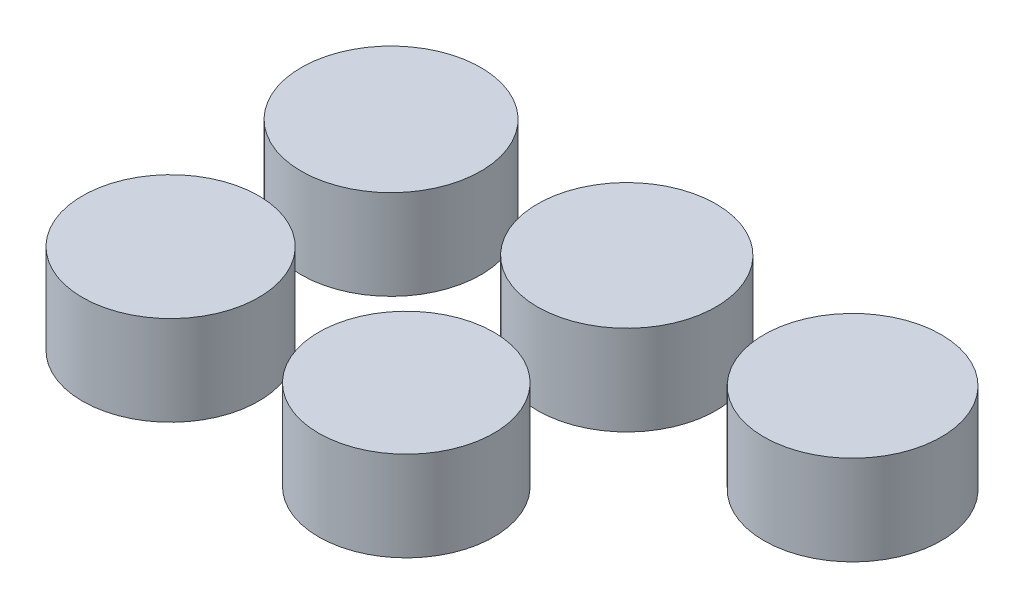
ISO-10303-21;
HEADER;
FILE_DESCRIPTION(('STEP AP214'),'2;1');
FILE_NAME('part.step','',(''),(''),'','','');
FILE_SCHEMA(('AUTOMOTIVE_DESIGN { 1 0 10303 214 1 1 1 1 }'));
ENDSEC;
DATA;
#1=APPLICATION_CONTEXT('core data for automotive mechanical design processes');
#2=APPLICATION_PROTOCOL_DEFINITION('international standard','automotive_design',2000,#1);
#3=PRODUCT_CONTEXT('',#1,'mechanical');
#4=PRODUCT('Part','Part','',(#3));
#5=PRODUCT_RELATED_PRODUCT_CATEGORY('part','',(#4));
#6=PRODUCT_DEFINITION_FORMATION('','',#4);
#7=PRODUCT_DEFINITION_CONTEXT('part definition',#1,'design');
#8=PRODUCT_DEFINITION('design','',#6,#7);
#9=PRODUCT_DEFINITION_SHAPE('','',#8);
#10=(LENGTH_UNIT() NAMED_UNIT(*) SI_UNIT(.MILLI.,.METRE.));
#11=(NAMED_UNIT(*) PLANE_ANGLE_UNIT() SI_UNIT($,.RADIAN.));
#12=(NAMED_UNIT(*) SI_UNIT($,.STERADIAN.) SOLID_ANGLE_UNIT());
#13=UNCERTAINTY_MEASURE_WITH_UNIT(LENGTH_MEASURE(1.E-05),#10,'distance_accuracy_value','');
#14=(GEOMETRIC_REPRESENTATION_CONTEXT(3) GLOBAL_UNCERTAINTY_ASSIGNED_CONTEXT((#13)) GLOBAL_UNIT_ASSIGNED_CONTEXT((#10,
#11,#12)) REPRESENTATION_CONTEXT('',''));
#15=CARTESIAN_POINT('',(0.,0.,0.));
#16=DIRECTION('',(0.,0.,1.));
#17=DIRECTION('',(1.,0.,0.));
#18=AXIS2_PLACEMENT_3D('',#15,#16,#17);
#19=CARTESIAN_POINT('',(10.4966153999829,4.,9.81889214374634));
#20=DIRECTION('',(0.,-1.,0.));
#21=DIRECTION('',(0.,0.,-1.));
#22=AXIS2_PLACEMENT_3D('',#19,#20,#21);
#23=CYLINDRICAL_SURFACE('',#22,3.9);
#24=CARTESIAN_POINT('',(10.4966153999829,4.,9.81889214374634));
#25=DIRECTION('',(0.,1.,0.));
#26=DIRECTION('',(0.,0.,1.));
#27=AXIS2_PLACEMENT_3D('',#24,#25,#26);
#28=CIRCLE('',#27,3.9);
#29=CARTESIAN_POINT('',(10.4966153999829,4.,13.7188921437463));
#30=VERTEX_POINT('',#29);
#31=EDGE_CURVE('E56',#30,#30,#28,.T.);
#32=ORIENTED_EDGE('',*,*,#31,.F.);
#33=EDGE_LOOP('',(#32));
#34=FACE_BOUND('',#33,.T.);
#35=CARTESIAN_POINT('',(10.4966153999829,0.,9.81889214374634));
#36=DIRECTION('',(0.,1.,0.));
#37=DIRECTION('',(0.,0.,1.));
#38=AXIS2_PLACEMENT_3D('',#35,#36,#37);
#39=CIRCLE('',#38,3.9);
#40=CARTESIAN_POINT('',(10.4966153999829,0.,13.7188921437463));
#41=VERTEX_POINT('',#40);
#42=EDGE_CURVE('E11',#41,#41,#39,.T.);
#43=ORIENTED_EDGE('',*,*,#42,.T.);
#44=EDGE_LOOP('',(#43));
#45=FACE_BOUND('',#44,.T.);
#46=ADVANCED_FACE('F52',(#34,#45),#23,.T.);
#47=CARTESIAN_POINT('',(10.4966153999829,4.,9.81889214374634));
#48=DIRECTION('',(0.,1.,0.));
#49=DIRECTION('',(0.,0.,1.));
#50=AXIS2_PLACEMENT_3D('',#47,#48,#49);
#51=PLANE('',#50);
#52=ORIENTED_EDGE('',*,*,#31,.T.);
#53=EDGE_LOOP('',(#52));
#54=FACE_BOUND('',#53,.T.);
#55=ADVANCED_FACE('F54',(#54),#51,.T.);
#56=CARTESIAN_POINT('',(10.4966153999829,0.,9.81889214374634));
#57=DIRECTION('',(0.,1.,0.));
#58=DIRECTION('',(0.,0.,1.));
#59=AXIS2_PLACEMENT_3D('',#56,#57,#58);
#60=PLANE('',#59);
#61=ORIENTED_EDGE('',*,*,#42,.F.);
#62=EDGE_LOOP('',(#61));
#63=FACE_BOUND('',#62,.T.);
#64=ADVANCED_FACE('F71',(#63),#60,.F.);
#65=CLOSED_SHELL('',(#46,#55,#64));
#66=MANIFOLD_SOLID_BREP('B2',#65);
#67=CARTESIAN_POINT('',(0.,4.,9.81889214374634));
#68=DIRECTION('',(0.,-1.,0.));
#69=DIRECTION('',(0.,0.,-1.));
#70=AXIS2_PLACEMENT_3D('',#67,#68,#69);
#71=CYLINDRICAL_SURFACE('',#70,3.925);
#72=CARTESIAN_POINT('',(0.,4.,9.81889214374634));
#73=DIRECTION('',(0.,1.,0.));
#74=DIRECTION('',(0.,0.,1.));
#75=AXIS2_PLACEMENT_3D('',#72,#73,#74);
#76=CIRCLE('',#75,3.925);
#77=CARTESIAN_POINT('',(0.,4.,13.7438921437463));
#78=VERTEX_POINT('',#77);
#79=EDGE_CURVE('E105',#78,#78,#76,.T.);
#80=ORIENTED_EDGE('',*,*,#79,.F.);
#81=EDGE_LOOP('',(#80));
#82=FACE_BOUND('',#81,.T.);
#83=CARTESIAN_POINT('',(0.,0.,9.81889214374634));
#84=DIRECTION('',(0.,1.,0.));
#85=DIRECTION('',(0.,0.,1.));
#86=AXIS2_PLACEMENT_3D('',#83,#84,#85);
#87=CIRCLE('',#86,3.925);
#88=CARTESIAN_POINT('',(0.,0.,13.7438921437463));
#89=VERTEX_POINT('',#88);
#90=EDGE_CURVE('E51',#89,#89,#87,.T.);
#91=ORIENTED_EDGE('',*,*,#90,.T.);
#92=EDGE_LOOP('',(#91));
#93=FACE_BOUND('',#92,.T.);
#94=ADVANCED_FACE('F101',(#82,#93),#71,.T.);
#95=CARTESIAN_POINT('',(0.,4.,9.81889214374634));
#96=DIRECTION('',(0.,1.,0.));
#97=DIRECTION('',(0.,0.,1.));
#98=AXIS2_PLACEMENT_3D('',#95,#96,#97);
#99=PLANE('',#98);
#100=ORIENTED_EDGE('',*,*,#79,.T.);
#101=EDGE_LOOP('',(#100));
#102=FACE_BOUND('',#101,.T.);
#103=ADVANCED_FACE('F103',(#102),#99,.T.);
#104=CARTESIAN_POINT('',(0.,0.,9.81889214374634));
#105=DIRECTION('',(0.,1.,0.));
#106=DIRECTION('',(0.,0.,1.));
#107=AXIS2_PLACEMENT_3D('',#104,#105,#106);
#108=PLANE('',#107);
#109=ORIENTED_EDGE('',*,*,#90,.F.);
#110=EDGE_LOOP('',(#109));
#111=FACE_BOUND('',#110,.T.);
#112=ADVANCED_FACE('F120',(#111),#108,.F.);
#113=CLOSED_SHELL('',(#94,#103,#112));
#114=MANIFOLD_SOLID_BREP('B6',#113);
#115=CARTESIAN_POINT('',(20.5558357401871,4.,0.));
#116=DIRECTION('',(0.,-1.,0.));
#117=DIRECTION('',(0.,0.,-1.));
#118=AXIS2_PLACEMENT_3D('',#115,#116,#117);
#119=CYLINDRICAL_SURFACE('',#118,3.95);
#120=CARTESIAN_POINT('',(20.5558357401871,4.,0.));
#121=DIRECTION('',(0.,1.,0.));
#122=DIRECTION('',(0.,0.,1.));
#123=AXIS2_PLACEMENT_3D('',#120,#121,#122);
#124=CIRCLE('',#123,3.95);
#125=CARTESIAN_POINT('',(20.5558357401871,4.,3.95));
#126=VERTEX_POINT('',#125);
#127=EDGE_CURVE('E154',#126,#126,#124,.T.);
#128=ORIENTED_EDGE('',*,*,#127,.F.);
#129=EDGE_LOOP('',(#128));
#130=FACE_BOUND('',#129,.T.);
#131=CARTESIAN_POINT('',(20.5558357401871,0.,0.));
#132=DIRECTION('',(0.,1.,0.));
#133=DIRECTION('',(0.,0.,1.));
#134=AXIS2_PLACEMENT_3D('',#131,#132,#133);
#135=CIRCLE('',#134,3.95);
#136=CARTESIAN_POINT('',(20.5558357401871,0.,3.95));
#137=VERTEX_POINT('',#136);
#138=EDGE_CURVE('E100',#137,#137,#135,.T.);
#139=ORIENTED_EDGE('',*,*,#138,.T.);
#140=EDGE_LOOP('',(#139));
#141=FACE_BOUND('',#140,.T.);
#142=ADVANCED_FACE('F150',(#130,#141),#119,.T.);
#143=CARTESIAN_POINT('',(20.5558357401871,4.,0.));
#144=DIRECTION('',(0.,1.,0.));
#145=DIRECTION('',(0.,0.,1.));
#146=AXIS2_PLACEMENT_3D('',#143,#144,#145);
#147=PLANE('',#146);
#148=ORIENTED_EDGE('',*,*,#127,.T.);
#149=EDGE_LOOP('',(#148));
#150=FACE_BOUND('',#149,.T.);
#151=ADVANCED_FACE('F152',(#150),#147,.T.);
#152=CARTESIAN_POINT('',(20.5558357401871,0.,0.));
#153=DIRECTION('',(0.,1.,0.));
#154=DIRECTION('',(0.,0.,1.));
#155=AXIS2_PLACEMENT_3D('',#152,#153,#154);
#156=PLANE('',#155);
#157=ORIENTED_EDGE('',*,*,#138,.F.);
#158=EDGE_LOOP('',(#157));
#159=FACE_BOUND('',#158,.T.);
#160=ADVANCED_FACE('F169',(#159),#156,.F.);
#161=CLOSED_SHELL('',(#142,#151,#160));
#162=MANIFOLD_SOLID_BREP('B46',#161);
#163=CARTESIAN_POINT('',(10.4966153999829,4.,0.));
#164=DIRECTION('',(0.,-1.,0.));
#165=DIRECTION('',(0.,0.,-1.));
#166=AXIS2_PLACEMENT_3D('',#163,#164,#165);
#167=CYLINDRICAL_SURFACE('',#166,3.975);
#168=CARTESIAN_POINT('',(10.4966153999829,4.,0.));
#169=DIRECTION('',(0.,1.,0.));
#170=DIRECTION('',(0.,0.,1.));
#171=AXIS2_PLACEMENT_3D('',#168,#169,#170);
#172=CIRCLE('',#171,3.975);
#173=CARTESIAN_POINT('',(10.4966153999829,4.,3.975));
#174=VERTEX_POINT('',#173);
#175=EDGE_CURVE('E202',#174,#174,#172,.T.);
#176=ORIENTED_EDGE('',*,*,#175,.F.);
#177=EDGE_LOOP('',(#176));
#178=FACE_BOUND('',#177,.T.);
#179=CARTESIAN_POINT('',(10.4966153999829,0.,0.));
#180=DIRECTION('',(0.,1.,0.));
#181=DIRECTION('',(0.,0.,1.));
#182=AXIS2_PLACEMENT_3D('',#179,#180,#181);
#183=CIRCLE('',#182,3.975);
#184=CARTESIAN_POINT('',(10.4966153999829,0.,3.975));
#185=VERTEX_POINT('',#184);
#186=EDGE_CURVE('E149',#185,#185,#183,.T.);
#187=ORIENTED_EDGE('',*,*,#186,.T.);
#188=EDGE_LOOP('',(#187));
#189=FACE_BOUND('',#188,.T.);
#190=ADVANCED_FACE('F198',(#178,#189),#167,.T.);
#191=CARTESIAN_POINT('',(10.4966153999829,4.,0.));
#192=DIRECTION('',(0.,1.,0.));
#193=DIRECTION('',(0.,0.,1.));
#194=AXIS2_PLACEMENT_3D('',#191,#192,#193);
#195=PLANE('',#194);
#196=ORIENTED_EDGE('',*,*,#175,.T.);
#197=EDGE_LOOP('',(#196));
#198=FACE_BOUND('',#197,.T.);
#199=ADVANCED_FACE('F200',(#198),#195,.T.);
#200=CARTESIAN_POINT('',(10.4966153999829,0.,0.));
#201=DIRECTION('',(0.,1.,0.));
#202=DIRECTION('',(0.,0.,1.));
#203=AXIS2_PLACEMENT_3D('',#200,#201,#202);
#204=PLANE('',#203);
#205=ORIENTED_EDGE('',*,*,#186,.F.);
#206=EDGE_LOOP('',(#205));
#207=FACE_BOUND('',#206,.T.);
#208=ADVANCED_FACE('F217',(#207),#204,.F.);
#209=CLOSED_SHELL('',(#190,#199,#208));
#210=MANIFOLD_SOLID_BREP('B95',#209);
#211=CARTESIAN_POINT('',(0.,4.,0.));
#212=DIRECTION('',(0.,-1.,0.));
#213=DIRECTION('',(0.,0.,-1.));
#214=AXIS2_PLACEMENT_3D('',#211,#212,#213);
#215=CYLINDRICAL_SURFACE('',#214,4.);
#216=CARTESIAN_POINT('',(0.,4.,0.));
#217=DIRECTION('',(0.,1.,0.));
#218=DIRECTION('',(0.,0.,1.));
#219=AXIS2_PLACEMENT_3D('',#216,#217,#218);
#220=CIRCLE('',#219,4.);
#221=CARTESIAN_POINT('',(0.,4.,4.));
#222=VERTEX_POINT('',#221);
#223=EDGE_CURVE('E197',#222,#222,#220,.T.);
#224=ORIENTED_EDGE('',*,*,#223,.F.);
#225=EDGE_LOOP('',(#224));
#226=FACE_BOUND('',#225,.T.);
#227=CARTESIAN_POINT('',(0.,0.,0.));
#228=DIRECTION('',(0.,1.,0.));
#229=DIRECTION('',(0.,0.,1.));
#230=AXIS2_PLACEMENT_3D('',#227,#228,#229);
#231=CIRCLE('',#230,4.);
#232=CARTESIAN_POINT('',(0.,0.,4.));
#233=VERTEX_POINT('',#232);
#234=EDGE_CURVE('E242',#233,#233,#231,.T.);
#235=ORIENTED_EDGE('',*,*,#234,.T.);
#236=EDGE_LOOP('',(#235));
#237=FACE_BOUND('',#236,.T.);
#238=ADVANCED_FACE('F239',(#226,#237),#215,.T.);
#239=CARTESIAN_POINT('',(0.,4.,0.));
#240=DIRECTION('',(0.,1.,0.));
#241=DIRECTION('',(0.,0.,1.));
#242=AXIS2_PLACEMENT_3D('',#239,#240,#241);
#243=PLANE('',#242);
#244=ORIENTED_EDGE('',*,*,#223,.T.);
#245=EDGE_LOOP('',(#244));
#246=FACE_BOUND('',#245,.T.);
#247=ADVANCED_FACE('F256',(#246),#243,.T.);
#248=CARTESIAN_POINT('',(0.,0.,0.));
#249=DIRECTION('',(0.,1.,0.));
#250=DIRECTION('',(0.,0.,1.));
#251=AXIS2_PLACEMENT_3D('',#248,#249,#250);
#252=PLANE('',#251);
#253=ORIENTED_EDGE('',*,*,#234,.F.);
#254=EDGE_LOOP('',(#253));
#255=FACE_BOUND('',#254,.T.);
#256=ADVANCED_FACE('F254',(#255),#252,.F.);
#257=CLOSED_SHELL('',(#238,#247,#256));
#258=MANIFOLD_SOLID_BREP('B144',#257);
#259=ADVANCED_BREP_SHAPE_REPRESENTATION('',(#18,#66,#114,#162,#210,#258),#14);
#260=SHAPE_DEFINITION_REPRESENTATION(#9,#259);
ENDSEC;
END-ISO-10303-21;
